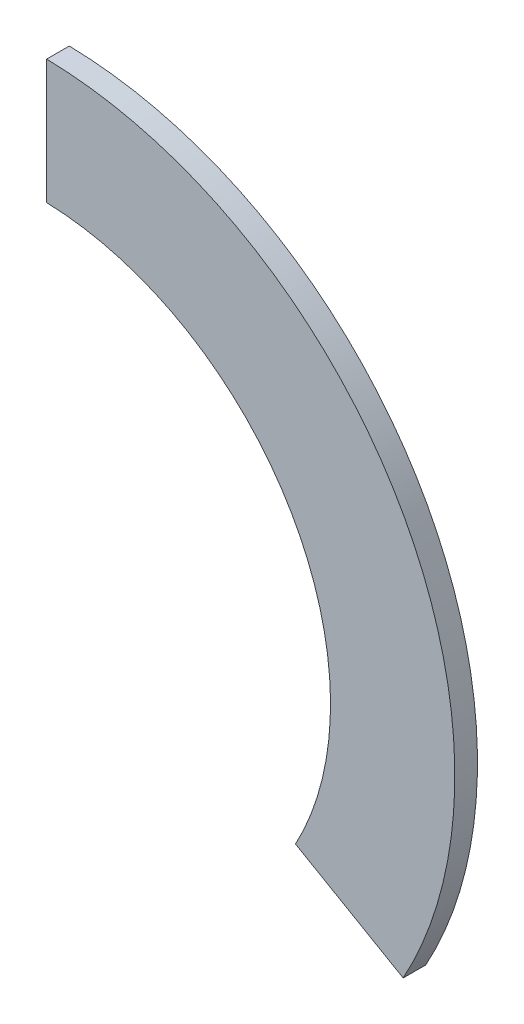
ISO-10303-21;
HEADER;
FILE_DESCRIPTION(('STEP AP214'),'2;1');
FILE_NAME('part.step','',(''),(''),'','','');
FILE_SCHEMA(('AUTOMOTIVE_DESIGN { 1 0 10303 214 1 1 1 1 }'));
ENDSEC;
DATA;
#1=APPLICATION_CONTEXT('core data for automotive mechanical design processes');
#2=APPLICATION_PROTOCOL_DEFINITION('international standard','automotive_design',2000,#1);
#3=PRODUCT_CONTEXT('',#1,'mechanical');
#4=PRODUCT('Part','Part','',(#3));
#5=PRODUCT_RELATED_PRODUCT_CATEGORY('part','',(#4));
#6=PRODUCT_DEFINITION_FORMATION('','',#4);
#7=PRODUCT_DEFINITION_CONTEXT('part definition',#1,'design');
#8=PRODUCT_DEFINITION('design','',#6,#7);
#9=PRODUCT_DEFINITION_SHAPE('','',#8);
#10=(LENGTH_UNIT() NAMED_UNIT(*) SI_UNIT(.MILLI.,.METRE.));
#11=(NAMED_UNIT(*) PLANE_ANGLE_UNIT() SI_UNIT($,.RADIAN.));
#12=(NAMED_UNIT(*) SI_UNIT($,.STERADIAN.) SOLID_ANGLE_UNIT());
#13=UNCERTAINTY_MEASURE_WITH_UNIT(LENGTH_MEASURE(1.E-05),#10,'distance_accuracy_value','');
#14=(GEOMETRIC_REPRESENTATION_CONTEXT(3) GLOBAL_UNCERTAINTY_ASSIGNED_CONTEXT((#13)) GLOBAL_UNIT_ASSIGNED_CONTEXT((#10,
#11,#12)) REPRESENTATION_CONTEXT('',''));
#15=CARTESIAN_POINT('',(0.,0.,0.));
#16=DIRECTION('',(0.,0.,1.));
#17=DIRECTION('',(1.,0.,0.));
#18=AXIS2_PLACEMENT_3D('',#15,#16,#17);
#19=CARTESIAN_POINT('',(0.,0.,4.));
#20=DIRECTION('',(0.,0.,-1.));
#21=DIRECTION('',(-1.,0.,0.));
#22=AXIS2_PLACEMENT_3D('',#19,#20,#21);
#23=CYLINDRICAL_SURFACE('',#22,73.61);
#24=CARTESIAN_POINT('',(0.,0.,0.));
#25=DIRECTION('',(0.,0.,-1.));
#26=DIRECTION('',(-1.,0.,0.));
#27=AXIS2_PLACEMENT_3D('',#24,#25,#26);
#28=CIRCLE('',#27,73.61);
#29=CARTESIAN_POINT('',(1.5,73.5947151635224,0.));
#30=VERTEX_POINT('',#29);
#31=CARTESIAN_POINT('',(64.4848553595727,-35.4983876993729,0.));
#32=VERTEX_POINT('',#31);
#33=EDGE_CURVE('E101',#30,#32,#28,.T.);
#34=ORIENTED_EDGE('',*,*,#33,.F.);
#35=DIRECTION('',(0.,0.,-1.));
#36=VECTOR('',#35,1.);
#37=CARTESIAN_POINT('',(1.5,73.5947151635224,4.));
#38=LINE('',#37,#36);
#39=CARTESIAN_POINT('',(1.5,73.5947151635224,4.));
#40=VERTEX_POINT('',#39);
#41=EDGE_CURVE('E11',#40,#30,#38,.T.);
#42=ORIENTED_EDGE('',*,*,#41,.F.);
#43=CARTESIAN_POINT('',(0.,0.,4.));
#44=DIRECTION('',(0.,0.,-1.));
#45=DIRECTION('',(-1.,0.,0.));
#46=AXIS2_PLACEMENT_3D('',#43,#44,#45);
#47=CIRCLE('',#46,73.61);
#48=CARTESIAN_POINT('',(64.4848553595727,-35.4983876993729,4.));
#49=VERTEX_POINT('',#48);
#50=EDGE_CURVE('E96',#40,#49,#47,.T.);
#51=ORIENTED_EDGE('',*,*,#50,.T.);
#52=DIRECTION('',(0.,0.,-1.));
#53=VECTOR('',#52,1.);
#54=CARTESIAN_POINT('',(64.4848553595727,-35.4983876993729,4.));
#55=LINE('',#54,#53);
#56=EDGE_CURVE('E39',#49,#32,#55,.T.);
#57=ORIENTED_EDGE('',*,*,#56,.T.);
#58=EDGE_LOOP('',(#34,#42,#51,#57));
#59=FACE_BOUND('',#58,.T.);
#60=ADVANCED_FACE('F36',(#59),#23,.T.);
#61=CARTESIAN_POINT('',(1.5,73.5947151635224,4.));
#62=DIRECTION('',(1.,0.,0.));
#63=DIRECTION('',(0.,1.,0.));
#64=AXIS2_PLACEMENT_3D('',#61,#62,#63);
#65=PLANE('',#64);
#66=DIRECTION('',(0.,-1.,0.));
#67=VECTOR('',#66,1.);
#68=CARTESIAN_POINT('',(1.5,73.5947151635224,0.));
#69=LINE('',#68,#67);
#70=CARTESIAN_POINT('',(1.5,51.6282141856563,0.));
#71=VERTEX_POINT('',#70);
#72=EDGE_CURVE('E69',#30,#71,#69,.T.);
#73=ORIENTED_EDGE('',*,*,#72,.T.);
#74=DIRECTION('',(0.,0.,-1.));
#75=VECTOR('',#74,1.);
#76=CARTESIAN_POINT('',(1.5,51.6282141856563,4.));
#77=LINE('',#76,#75);
#78=CARTESIAN_POINT('',(1.5,51.6282141856563,4.));
#79=VERTEX_POINT('',#78);
#80=EDGE_CURVE('E45',#79,#71,#77,.T.);
#81=ORIENTED_EDGE('',*,*,#80,.F.);
#82=DIRECTION('',(0.,-1.,0.));
#83=VECTOR('',#82,1.);
#84=CARTESIAN_POINT('',(1.5,73.5947151635224,4.));
#85=LINE('',#84,#83);
#86=EDGE_CURVE('E86',#40,#79,#85,.T.);
#87=ORIENTED_EDGE('',*,*,#86,.F.);
#88=ORIENTED_EDGE('',*,*,#41,.T.);
#89=EDGE_LOOP('',(#73,#81,#87,#88));
#90=FACE_BOUND('',#89,.T.);
#91=ADVANCED_FACE('F111',(#90),#65,.F.);
#92=CARTESIAN_POINT('',(0.,0.,4.));
#93=DIRECTION('',(0.,0.,-1.));
#94=DIRECTION('',(-1.,0.,0.));
#95=AXIS2_PLACEMENT_3D('',#92,#93,#94);
#96=CYLINDRICAL_SURFACE('',#95,51.65);
#97=CARTESIAN_POINT('',(0.,0.,0.));
#98=DIRECTION('',(0.,0.,-1.));
#99=DIRECTION('',(-1.,0.,0.));
#100=AXIS2_PLACEMENT_3D('',#97,#98,#99);
#101=CIRCLE('',#100,51.65);
#102=CARTESIAN_POINT('',(45.46130806522,-24.5151375480368,0.));
#103=VERTEX_POINT('',#102);
#104=EDGE_CURVE('E93',#71,#103,#101,.T.);
#105=ORIENTED_EDGE('',*,*,#104,.T.);
#106=DIRECTION('',(0.,0.,-1.));
#107=VECTOR('',#106,1.);
#108=CARTESIAN_POINT('',(45.46130806522,-24.5151375480368,4.));
#109=LINE('',#108,#107);
#110=CARTESIAN_POINT('',(45.46130806522,-24.5151375480368,4.));
#111=VERTEX_POINT('',#110);
#112=EDGE_CURVE('E90',#111,#103,#109,.T.);
#113=ORIENTED_EDGE('',*,*,#112,.F.);
#114=CARTESIAN_POINT('',(0.,0.,4.));
#115=DIRECTION('',(0.,0.,-1.));
#116=DIRECTION('',(-1.,0.,0.));
#117=AXIS2_PLACEMENT_3D('',#114,#115,#116);
#118=CIRCLE('',#117,51.65);
#119=EDGE_CURVE('E81',#79,#111,#118,.T.);
#120=ORIENTED_EDGE('',*,*,#119,.F.);
#121=ORIENTED_EDGE('',*,*,#80,.T.);
#122=EDGE_LOOP('',(#105,#113,#120,#121));
#123=FACE_BOUND('',#122,.T.);
#124=ADVANCED_FACE('F91',(#123),#96,.F.);
#125=CARTESIAN_POINT('',(64.4848553595727,-35.4983876993729,4.));
#126=DIRECTION('',(-0.499999999999998,-0.86602540378444,0.));
#127=DIRECTION('',(0.86602540378444,-0.499999999999998,0.));
#128=AXIS2_PLACEMENT_3D('',#125,#126,#127);
#129=PLANE('',#128);
#130=DIRECTION('',(-0.86602540378444,0.499999999999998,0.));
#131=VECTOR('',#130,1.);
#132=CARTESIAN_POINT('',(64.4848553595727,-35.4983876993729,0.));
#133=LINE('',#132,#131);
#134=EDGE_CURVE('E104',#32,#103,#133,.T.);
#135=ORIENTED_EDGE('',*,*,#134,.F.);
#136=ORIENTED_EDGE('',*,*,#56,.F.);
#137=DIRECTION('',(-0.86602540378444,0.499999999999998,0.));
#138=VECTOR('',#137,1.);
#139=CARTESIAN_POINT('',(64.4848553595727,-35.4983876993729,4.));
#140=LINE('',#139,#138);
#141=EDGE_CURVE('E85',#49,#111,#140,.T.);
#142=ORIENTED_EDGE('',*,*,#141,.T.);
#143=ORIENTED_EDGE('',*,*,#112,.T.);
#144=EDGE_LOOP('',(#135,#136,#142,#143));
#145=FACE_BOUND('',#144,.T.);
#146=ADVANCED_FACE('F95',(#145),#129,.T.);
#147=CARTESIAN_POINT('',(0.,0.,4.));
#148=DIRECTION('',(0.,0.,-1.));
#149=DIRECTION('',(-1.,0.,0.));
#150=AXIS2_PLACEMENT_3D('',#147,#148,#149);
#151=PLANE('',#150);
#152=ORIENTED_EDGE('',*,*,#50,.F.);
#153=ORIENTED_EDGE('',*,*,#86,.T.);
#154=ORIENTED_EDGE('',*,*,#119,.T.);
#155=ORIENTED_EDGE('',*,*,#141,.F.);
#156=EDGE_LOOP('',(#152,#153,#154,#155));
#157=FACE_BOUND('',#156,.T.);
#158=ADVANCED_FACE('F84',(#157),#151,.F.);
#159=CARTESIAN_POINT('',(0.,0.,0.));
#160=DIRECTION('',(0.,0.,-1.));
#161=DIRECTION('',(-1.,0.,0.));
#162=AXIS2_PLACEMENT_3D('',#159,#160,#161);
#163=PLANE('',#162);
#164=ORIENTED_EDGE('',*,*,#33,.T.);
#165=ORIENTED_EDGE('',*,*,#134,.T.);
#166=ORIENTED_EDGE('',*,*,#104,.F.);
#167=ORIENTED_EDGE('',*,*,#72,.F.);
#168=EDGE_LOOP('',(#164,#165,#166,#167));
#169=FACE_BOUND('',#168,.T.);
#170=ADVANCED_FACE('F109',(#169),#163,.T.);
#171=CLOSED_SHELL('',(#60,#91,#124,#146,#158,#170));
#172=MANIFOLD_SOLID_BREP('B2',#171);
#173=ADVANCED_BREP_SHAPE_REPRESENTATION('',(#18,#172),#14);
#174=SHAPE_DEFINITION_REPRESENTATION(#9,#173);
ENDSEC;
END-ISO-10303-21;
